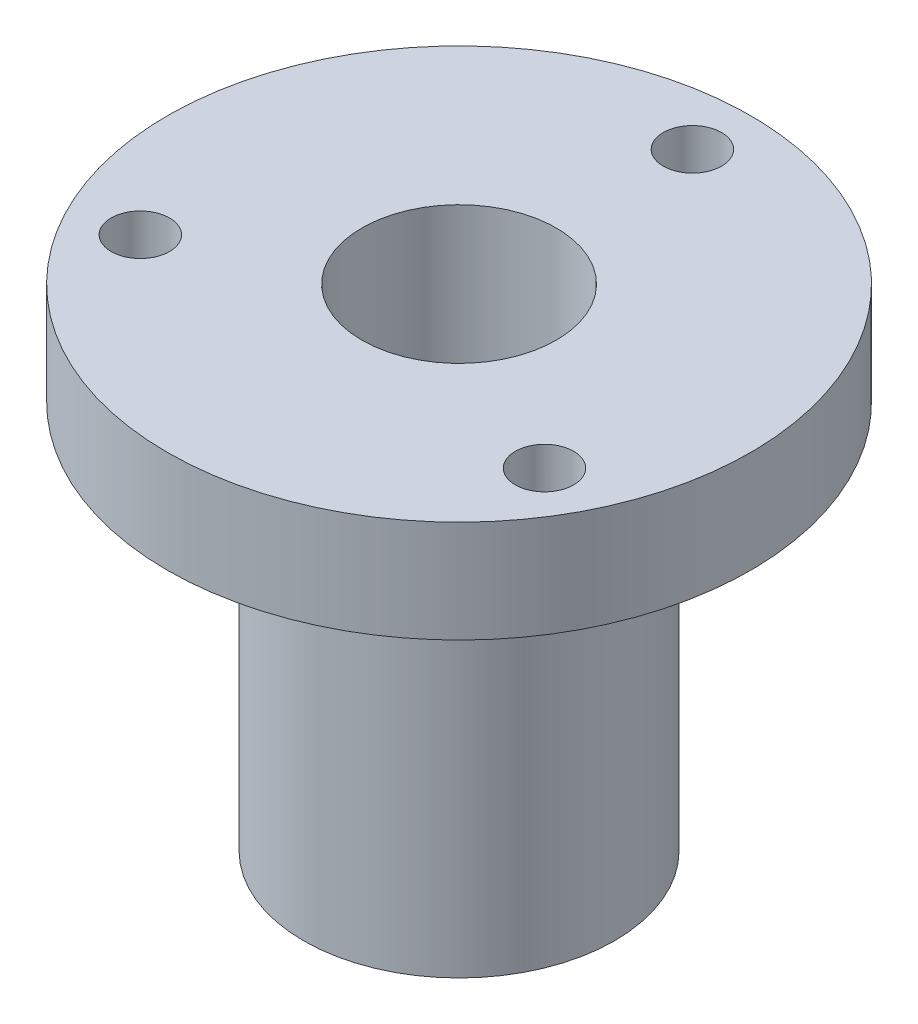
ISO-10303-21;
HEADER;
FILE_DESCRIPTION(('STEP AP214'),'2;1');
FILE_NAME('part.step','',(''),(''),'','','');
FILE_SCHEMA(('AUTOMOTIVE_DESIGN { 1 0 10303 214 1 1 1 1 }'));
ENDSEC;
DATA;
#1=APPLICATION_CONTEXT('core data for automotive mechanical design processes');
#2=APPLICATION_PROTOCOL_DEFINITION('international standard','automotive_design',2000,#1);
#3=PRODUCT_CONTEXT('',#1,'mechanical');
#4=PRODUCT('Part','Part','',(#3));
#5=PRODUCT_RELATED_PRODUCT_CATEGORY('part','',(#4));
#6=PRODUCT_DEFINITION_FORMATION('','',#4);
#7=PRODUCT_DEFINITION_CONTEXT('part definition',#1,'design');
#8=PRODUCT_DEFINITION('design','',#6,#7);
#9=PRODUCT_DEFINITION_SHAPE('','',#8);
#10=(LENGTH_UNIT() NAMED_UNIT(*) SI_UNIT(.MILLI.,.METRE.));
#11=(NAMED_UNIT(*) PLANE_ANGLE_UNIT() SI_UNIT($,.RADIAN.));
#12=(NAMED_UNIT(*) SI_UNIT($,.STERADIAN.) SOLID_ANGLE_UNIT());
#13=UNCERTAINTY_MEASURE_WITH_UNIT(LENGTH_MEASURE(1.E-05),#10,'distance_accuracy_value','');
#14=(GEOMETRIC_REPRESENTATION_CONTEXT(3) GLOBAL_UNCERTAINTY_ASSIGNED_CONTEXT((#13)) GLOBAL_UNIT_ASSIGNED_CONTEXT((#10,
#11,#12)) REPRESENTATION_CONTEXT('',''));
#15=CARTESIAN_POINT('',(0.,0.,0.));
#16=DIRECTION('',(0.,0.,1.));
#17=DIRECTION('',(1.,0.,0.));
#18=AXIS2_PLACEMENT_3D('',#15,#16,#17);
#19=CARTESIAN_POINT('',(-15.,6.82692307692308,0.));
#20=DIRECTION('',(0.,1.,0.));
#21=DIRECTION('',(0.,0.,1.));
#22=AXIS2_PLACEMENT_3D('',#19,#20,#21);
#23=PLANE('',#22);
#24=CARTESIAN_POINT('',(10.3923048454133,6.82692307692308,5.9999999999999));
#25=DIRECTION('',(0.,1.,0.));
#26=DIRECTION('',(-0.866025403784443,0.,-0.499999999999992));
#27=AXIS2_PLACEMENT_3D('',#24,#25,#26);
#28=CIRCLE('',#27,1.5);
#29=CARTESIAN_POINT('',(9.09326673973665,6.82692307692308,5.24999999999992));
#30=VERTEX_POINT('',#29);
#31=EDGE_CURVE('E63',#30,#30,#28,.T.);
#32=ORIENTED_EDGE('',*,*,#31,.F.);
#33=EDGE_LOOP('',(#32));
#34=FACE_BOUND('',#33,.T.);
#35=CARTESIAN_POINT('',(-10.3923048454132,6.82692307692308,6.00000000000005));
#36=DIRECTION('',(0.,1.,0.));
#37=DIRECTION('',(0.866025403784436,0.,-0.500000000000004));
#38=AXIS2_PLACEMENT_3D('',#35,#36,#37);
#39=CIRCLE('',#38,1.5);
#40=CARTESIAN_POINT('',(-9.09326673973658,6.82692307692308,5.25000000000004));
#41=VERTEX_POINT('',#40);
#42=EDGE_CURVE('E53',#41,#41,#39,.T.);
#43=ORIENTED_EDGE('',*,*,#42,.F.);
#44=EDGE_LOOP('',(#43));
#45=FACE_BOUND('',#44,.T.);
#46=CARTESIAN_POINT('',(0.,6.82692307692308,-12.));
#47=DIRECTION('',(0.,1.,0.));
#48=DIRECTION('',(0.,0.,1.));
#49=AXIS2_PLACEMENT_3D('',#46,#47,#48);
#50=CIRCLE('',#49,1.5);
#51=CARTESIAN_POINT('',(0.,6.82692307692308,-10.5));
#52=VERTEX_POINT('',#51);
#53=EDGE_CURVE('E50',#52,#52,#50,.T.);
#54=ORIENTED_EDGE('',*,*,#53,.F.);
#55=EDGE_LOOP('',(#54));
#56=FACE_BOUND('',#55,.T.);
#57=CARTESIAN_POINT('',(0.,6.82692307692308,0.));
#58=DIRECTION('',(0.,1.,0.));
#59=DIRECTION('',(0.,0.,1.));
#60=AXIS2_PLACEMENT_3D('',#57,#58,#59);
#61=CIRCLE('',#60,15.);
#62=CARTESIAN_POINT('',(0.,6.82692307692308,15.));
#63=VERTEX_POINT('',#62);
#64=EDGE_CURVE('E49',#63,#63,#61,.T.);
#65=ORIENTED_EDGE('',*,*,#64,.T.);
#66=EDGE_LOOP('',(#65));
#67=FACE_BOUND('',#66,.T.);
#68=CARTESIAN_POINT('',(0.,6.82692307692308,0.));
#69=DIRECTION('',(0.,1.,0.));
#70=DIRECTION('',(0.,0.,1.));
#71=AXIS2_PLACEMENT_3D('',#68,#69,#70);
#72=CIRCLE('',#71,5.);
#73=CARTESIAN_POINT('',(0.,6.82692307692308,5.));
#74=VERTEX_POINT('',#73);
#75=EDGE_CURVE('E10',#74,#74,#72,.T.);
#76=ORIENTED_EDGE('',*,*,#75,.F.);
#77=EDGE_LOOP('',(#76));
#78=FACE_BOUND('',#77,.T.);
#79=ADVANCED_FACE('F31',(#34,#45,#56,#67,#78),#23,.T.);
#80=CARTESIAN_POINT('',(0.,6.00000000000001,0.));
#81=DIRECTION('',(0.,1.,0.));
#82=DIRECTION('',(0.,0.,1.));
#83=AXIS2_PLACEMENT_3D('',#80,#81,#82);
#84=CYLINDRICAL_SURFACE('',#83,5.);
#85=ORIENTED_EDGE('',*,*,#75,.T.);
#86=EDGE_LOOP('',(#85));
#87=FACE_BOUND('',#86,.T.);
#88=CARTESIAN_POINT('',(0.,-18.4230769230769,0.));
#89=DIRECTION('',(0.,1.,0.));
#90=DIRECTION('',(0.,0.,1.));
#91=AXIS2_PLACEMENT_3D('',#88,#89,#90);
#92=CIRCLE('',#91,5.);
#93=CARTESIAN_POINT('',(0.,-18.4230769230769,5.));
#94=VERTEX_POINT('',#93);
#95=EDGE_CURVE('E38',#94,#94,#92,.T.);
#96=ORIENTED_EDGE('',*,*,#95,.F.);
#97=EDGE_LOOP('',(#96));
#98=FACE_BOUND('',#97,.T.);
#99=ADVANCED_FACE('F81',(#87,#98),#84,.F.);
#100=CARTESIAN_POINT('',(-5.,-18.4230769230769,0.));
#101=DIRECTION('',(0.,-1.,0.));
#102=DIRECTION('',(0.,0.,-1.));
#103=AXIS2_PLACEMENT_3D('',#100,#101,#102);
#104=PLANE('',#103);
#105=ORIENTED_EDGE('',*,*,#95,.T.);
#106=EDGE_LOOP('',(#105));
#107=FACE_BOUND('',#106,.T.);
#108=CARTESIAN_POINT('',(0.,-18.4230769230769,0.));
#109=DIRECTION('',(0.,1.,0.));
#110=DIRECTION('',(0.,0.,1.));
#111=AXIS2_PLACEMENT_3D('',#108,#109,#110);
#112=CIRCLE('',#111,8.);
#113=CARTESIAN_POINT('',(0.,-18.4230769230769,8.));
#114=VERTEX_POINT('',#113);
#115=EDGE_CURVE('E43',#114,#114,#112,.T.);
#116=ORIENTED_EDGE('',*,*,#115,.F.);
#117=EDGE_LOOP('',(#116));
#118=FACE_BOUND('',#117,.T.);
#119=ADVANCED_FACE('F79',(#107,#118),#104,.T.);
#120=CARTESIAN_POINT('',(0.,6.00000000000001,0.));
#121=DIRECTION('',(0.,1.,0.));
#122=DIRECTION('',(0.,0.,1.));
#123=AXIS2_PLACEMENT_3D('',#120,#121,#122);
#124=CYLINDRICAL_SURFACE('',#123,8.);
#125=ORIENTED_EDGE('',*,*,#115,.T.);
#126=EDGE_LOOP('',(#125));
#127=FACE_BOUND('',#126,.T.);
#128=CARTESIAN_POINT('',(0.,1.57692307692308,0.));
#129=DIRECTION('',(0.,1.,0.));
#130=DIRECTION('',(0.,0.,1.));
#131=AXIS2_PLACEMENT_3D('',#128,#129,#130);
#132=CIRCLE('',#131,8.);
#133=CARTESIAN_POINT('',(0.,1.57692307692308,8.));
#134=VERTEX_POINT('',#133);
#135=EDGE_CURVE('E71',#134,#134,#132,.T.);
#136=ORIENTED_EDGE('',*,*,#135,.F.);
#137=EDGE_LOOP('',(#136));
#138=FACE_BOUND('',#137,.T.);
#139=ADVANCED_FACE('F76',(#127,#138),#124,.T.);
#140=CARTESIAN_POINT('',(-8.,1.57692307692308,0.));
#141=DIRECTION('',(0.,-1.,0.));
#142=DIRECTION('',(0.,0.,-1.));
#143=AXIS2_PLACEMENT_3D('',#140,#141,#142);
#144=PLANE('',#143);
#145=CARTESIAN_POINT('',(10.3923048454133,1.57692307692308,5.9999999999999));
#146=DIRECTION('',(0.,-1.,0.));
#147=DIRECTION('',(0.,0.,-1.));
#148=AXIS2_PLACEMENT_3D('',#145,#146,#147);
#149=CIRCLE('',#148,1.5);
#150=CARTESIAN_POINT('',(10.3923048454133,1.57692307692308,4.4999999999999));
#151=VERTEX_POINT('',#150);
#152=EDGE_CURVE('E34',#151,#151,#149,.T.);
#153=ORIENTED_EDGE('',*,*,#152,.F.);
#154=EDGE_LOOP('',(#153));
#155=FACE_BOUND('',#154,.T.);
#156=CARTESIAN_POINT('',(-10.3923048454132,1.57692307692308,6.00000000000005));
#157=DIRECTION('',(0.,-1.,0.));
#158=DIRECTION('',(0.,0.,-1.));
#159=AXIS2_PLACEMENT_3D('',#156,#157,#158);
#160=CIRCLE('',#159,1.5);
#161=CARTESIAN_POINT('',(-10.3923048454132,1.57692307692308,4.50000000000005));
#162=VERTEX_POINT('',#161);
#163=EDGE_CURVE('E51',#162,#162,#160,.T.);
#164=ORIENTED_EDGE('',*,*,#163,.F.);
#165=EDGE_LOOP('',(#164));
#166=FACE_BOUND('',#165,.T.);
#167=CARTESIAN_POINT('',(0.,1.57692307692308,-12.));
#168=DIRECTION('',(0.,-1.,0.));
#169=DIRECTION('',(0.,0.,-1.));
#170=AXIS2_PLACEMENT_3D('',#167,#168,#169);
#171=CIRCLE('',#170,1.5);
#172=CARTESIAN_POINT('',(0.,1.57692307692308,-13.5));
#173=VERTEX_POINT('',#172);
#174=EDGE_CURVE('E47',#173,#173,#171,.T.);
#175=ORIENTED_EDGE('',*,*,#174,.F.);
#176=EDGE_LOOP('',(#175));
#177=FACE_BOUND('',#176,.T.);
#178=ORIENTED_EDGE('',*,*,#135,.T.);
#179=EDGE_LOOP('',(#178));
#180=FACE_BOUND('',#179,.T.);
#181=CARTESIAN_POINT('',(0.,1.57692307692308,0.));
#182=DIRECTION('',(0.,1.,0.));
#183=DIRECTION('',(0.,0.,1.));
#184=AXIS2_PLACEMENT_3D('',#181,#182,#183);
#185=CIRCLE('',#184,15.);
#186=CARTESIAN_POINT('',(0.,1.57692307692308,15.));
#187=VERTEX_POINT('',#186);
#188=EDGE_CURVE('E68',#187,#187,#185,.T.);
#189=ORIENTED_EDGE('',*,*,#188,.F.);
#190=EDGE_LOOP('',(#189));
#191=FACE_BOUND('',#190,.T.);
#192=ADVANCED_FACE('F88',(#155,#166,#177,#180,#191),#144,.T.);
#193=CARTESIAN_POINT('',(0.,6.00000000000001,0.));
#194=DIRECTION('',(0.,1.,0.));
#195=DIRECTION('',(0.,0.,1.));
#196=AXIS2_PLACEMENT_3D('',#193,#194,#195);
#197=CYLINDRICAL_SURFACE('',#196,15.);
#198=ORIENTED_EDGE('',*,*,#188,.T.);
#199=EDGE_LOOP('',(#198));
#200=FACE_BOUND('',#199,.T.);
#201=ORIENTED_EDGE('',*,*,#64,.F.);
#202=EDGE_LOOP('',(#201));
#203=FACE_BOUND('',#202,.T.);
#204=ADVANCED_FACE('F103',(#200,#203),#197,.T.);
#205=CARTESIAN_POINT('',(0.,-3.17307692307692,-12.));
#206=DIRECTION('',(0.,1.,0.));
#207=DIRECTION('',(0.,0.,1.));
#208=AXIS2_PLACEMENT_3D('',#205,#206,#207);
#209=CYLINDRICAL_SURFACE('',#208,1.5);
#210=ORIENTED_EDGE('',*,*,#174,.T.);
#211=EDGE_LOOP('',(#210));
#212=FACE_BOUND('',#211,.T.);
#213=ORIENTED_EDGE('',*,*,#53,.T.);
#214=EDGE_LOOP('',(#213));
#215=FACE_BOUND('',#214,.T.);
#216=ADVANCED_FACE('F105',(#212,#215),#209,.F.);
#217=CARTESIAN_POINT('',(-10.3923048454132,-3.17307692307692,6.00000000000005));
#218=DIRECTION('',(0.,1.,0.));
#219=DIRECTION('',(0.,0.,1.));
#220=AXIS2_PLACEMENT_3D('',#217,#218,#219);
#221=CYLINDRICAL_SURFACE('',#220,1.5);
#222=ORIENTED_EDGE('',*,*,#163,.T.);
#223=EDGE_LOOP('',(#222));
#224=FACE_BOUND('',#223,.T.);
#225=ORIENTED_EDGE('',*,*,#42,.T.);
#226=EDGE_LOOP('',(#225));
#227=FACE_BOUND('',#226,.T.);
#228=ADVANCED_FACE('F112',(#224,#227),#221,.F.);
#229=CARTESIAN_POINT('',(10.3923048454133,-3.17307692307692,5.9999999999999));
#230=DIRECTION('',(0.,1.,0.));
#231=DIRECTION('',(0.,0.,1.));
#232=AXIS2_PLACEMENT_3D('',#229,#230,#231);
#233=CYLINDRICAL_SURFACE('',#232,1.5);
#234=ORIENTED_EDGE('',*,*,#152,.T.);
#235=EDGE_LOOP('',(#234));
#236=FACE_BOUND('',#235,.T.);
#237=ORIENTED_EDGE('',*,*,#31,.T.);
#238=EDGE_LOOP('',(#237));
#239=FACE_BOUND('',#238,.T.);
#240=ADVANCED_FACE('F120',(#236,#239),#233,.F.);
#241=CLOSED_SHELL('',(#79,#99,#119,#139,#192,#204,#216,#228,#240));
#242=MANIFOLD_SOLID_BREP('B2',#241);
#243=ADVANCED_BREP_SHAPE_REPRESENTATION('',(#18,#242),#14);
#244=SHAPE_DEFINITION_REPRESENTATION(#9,#243);
ENDSEC;
END-ISO-10303-21;
